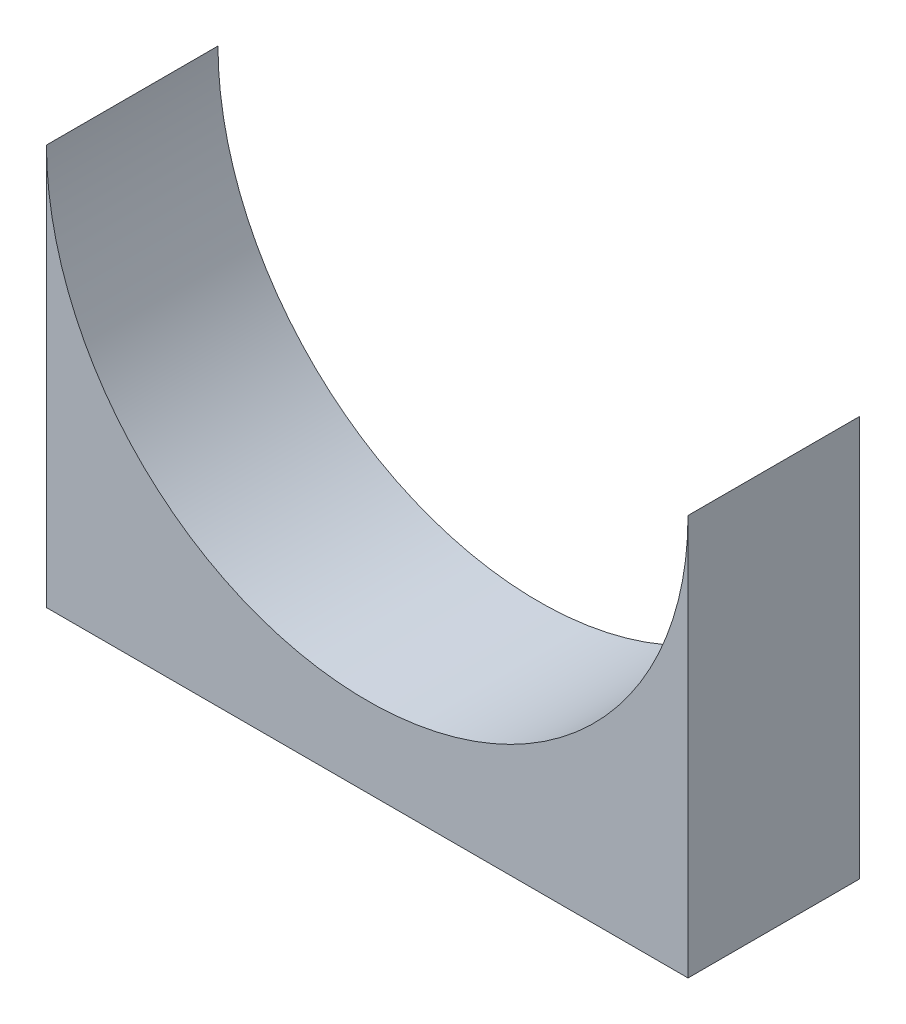
ISO-10303-21;
HEADER;
FILE_DESCRIPTION(('STEP AP214'),'2;1');
FILE_NAME('part.step','',(''),(''),'','','');
FILE_SCHEMA(('AUTOMOTIVE_DESIGN { 1 0 10303 214 1 1 1 1 }'));
ENDSEC;
DATA;
#1=APPLICATION_CONTEXT('core data for automotive mechanical design processes');
#2=APPLICATION_PROTOCOL_DEFINITION('international standard','automotive_design',2000,#1);
#3=PRODUCT_CONTEXT('',#1,'mechanical');
#4=PRODUCT('Part','Part','',(#3));
#5=PRODUCT_RELATED_PRODUCT_CATEGORY('part','',(#4));
#6=PRODUCT_DEFINITION_FORMATION('','',#4);
#7=PRODUCT_DEFINITION_CONTEXT('part definition',#1,'design');
#8=PRODUCT_DEFINITION('design','',#6,#7);
#9=PRODUCT_DEFINITION_SHAPE('','',#8);
#10=(LENGTH_UNIT() NAMED_UNIT(*) SI_UNIT(.MILLI.,.METRE.));
#11=(NAMED_UNIT(*) PLANE_ANGLE_UNIT() SI_UNIT($,.RADIAN.));
#12=(NAMED_UNIT(*) SI_UNIT($,.STERADIAN.) SOLID_ANGLE_UNIT());
#13=UNCERTAINTY_MEASURE_WITH_UNIT(LENGTH_MEASURE(1.E-05),#10,'distance_accuracy_value','');
#14=(GEOMETRIC_REPRESENTATION_CONTEXT(3) GLOBAL_UNCERTAINTY_ASSIGNED_CONTEXT((#13)) GLOBAL_UNIT_ASSIGNED_CONTEXT((#10,
#11,#12)) REPRESENTATION_CONTEXT('',''));
#15=CARTESIAN_POINT('',(0.,0.,0.));
#16=DIRECTION('',(0.,0.,1.));
#17=DIRECTION('',(1.,0.,0.));
#18=AXIS2_PLACEMENT_3D('',#15,#16,#17);
#19=CARTESIAN_POINT('',(0.,11.6748648648649,10.));
#20=DIRECTION('',(0.,0.,-1.));
#21=DIRECTION('',(-1.,0.,0.));
#22=AXIS2_PLACEMENT_3D('',#19,#20,#21);
#23=CYLINDRICAL_SURFACE('',#22,18.7);
#24=CARTESIAN_POINT('',(0.,11.6748648648649,0.));
#25=DIRECTION('',(0.,0.,-1.));
#26=DIRECTION('',(1.,0.,0.));
#27=AXIS2_PLACEMENT_3D('',#24,#25,#26);
#28=CIRCLE('',#27,18.7);
#29=CARTESIAN_POINT('',(18.7,11.6748648648649,0.));
#30=VERTEX_POINT('',#29);
#31=CARTESIAN_POINT('',(-18.7,11.6748648648649,0.));
#32=VERTEX_POINT('',#31);
#33=EDGE_CURVE('E100',#30,#32,#28,.T.);
#34=ORIENTED_EDGE('',*,*,#33,.T.);
#35=DIRECTION('',(0.,0.,-1.));
#36=VECTOR('',#35,1.);
#37=CARTESIAN_POINT('',(-18.7,11.6748648648649,10.));
#38=LINE('',#37,#36);
#39=CARTESIAN_POINT('',(-18.7,11.6748648648649,10.));
#40=VERTEX_POINT('',#39);
#41=EDGE_CURVE('E11',#40,#32,#38,.T.);
#42=ORIENTED_EDGE('',*,*,#41,.F.);
#43=CARTESIAN_POINT('',(0.,11.6748648648649,10.));
#44=DIRECTION('',(0.,0.,-1.));
#45=DIRECTION('',(1.,0.,0.));
#46=AXIS2_PLACEMENT_3D('',#43,#44,#45);
#47=CIRCLE('',#46,18.7);
#48=CARTESIAN_POINT('',(18.7,11.6748648648649,10.));
#49=VERTEX_POINT('',#48);
#50=EDGE_CURVE('E88',#49,#40,#47,.T.);
#51=ORIENTED_EDGE('',*,*,#50,.F.);
#52=DIRECTION('',(0.,0.,-1.));
#53=VECTOR('',#52,1.);
#54=CARTESIAN_POINT('',(18.7,11.6748648648649,10.));
#55=LINE('',#54,#53);
#56=EDGE_CURVE('E96',#49,#30,#55,.T.);
#57=ORIENTED_EDGE('',*,*,#56,.T.);
#58=EDGE_LOOP('',(#34,#42,#51,#57));
#59=FACE_BOUND('',#58,.T.);
#60=ADVANCED_FACE('F37',(#59),#23,.F.);
#61=CARTESIAN_POINT('',(-18.7,11.6748648648649,10.));
#62=DIRECTION('',(1.,0.,0.));
#63=DIRECTION('',(0.,0.,-1.));
#64=AXIS2_PLACEMENT_3D('',#61,#62,#63);
#65=PLANE('',#64);
#66=DIRECTION('',(0.,-1.,0.));
#67=VECTOR('',#66,1.);
#68=CARTESIAN_POINT('',(-18.7,11.6748648648649,0.));
#69=LINE('',#68,#67);
#70=CARTESIAN_POINT('',(-18.7,-11.6748648648649,0.));
#71=VERTEX_POINT('',#70);
#72=EDGE_CURVE('E92',#32,#71,#69,.T.);
#73=ORIENTED_EDGE('',*,*,#72,.T.);
#74=DIRECTION('',(0.,0.,-1.));
#75=VECTOR('',#74,1.);
#76=CARTESIAN_POINT('',(-18.7,-11.6748648648649,10.));
#77=LINE('',#76,#75);
#78=CARTESIAN_POINT('',(-18.7,-11.6748648648649,10.));
#79=VERTEX_POINT('',#78);
#80=EDGE_CURVE('E45',#79,#71,#77,.T.);
#81=ORIENTED_EDGE('',*,*,#80,.F.);
#82=DIRECTION('',(0.,-1.,0.));
#83=VECTOR('',#82,1.);
#84=CARTESIAN_POINT('',(-18.7,11.6748648648649,10.));
#85=LINE('',#84,#83);
#86=EDGE_CURVE('E83',#40,#79,#85,.T.);
#87=ORIENTED_EDGE('',*,*,#86,.F.);
#88=ORIENTED_EDGE('',*,*,#41,.T.);
#89=EDGE_LOOP('',(#73,#81,#87,#88));
#90=FACE_BOUND('',#89,.T.);
#91=ADVANCED_FACE('F91',(#90),#65,.F.);
#92=CARTESIAN_POINT('',(-18.7,-11.6748648648649,10.));
#93=DIRECTION('',(0.,1.,0.));
#94=DIRECTION('',(0.,0.,1.));
#95=AXIS2_PLACEMENT_3D('',#92,#93,#94);
#96=PLANE('',#95);
#97=DIRECTION('',(1.,0.,0.));
#98=VECTOR('',#97,1.);
#99=CARTESIAN_POINT('',(-18.7,-11.6748648648649,0.));
#100=LINE('',#99,#98);
#101=CARTESIAN_POINT('',(18.7,-11.6748648648649,0.));
#102=VERTEX_POINT('',#101);
#103=EDGE_CURVE('E70',#71,#102,#100,.T.);
#104=ORIENTED_EDGE('',*,*,#103,.T.);
#105=DIRECTION('',(0.,0.,-1.));
#106=VECTOR('',#105,1.);
#107=CARTESIAN_POINT('',(18.7,-11.6748648648649,10.));
#108=LINE('',#107,#106);
#109=CARTESIAN_POINT('',(18.7,-11.6748648648649,10.));
#110=VERTEX_POINT('',#109);
#111=EDGE_CURVE('E93',#110,#102,#108,.T.);
#112=ORIENTED_EDGE('',*,*,#111,.F.);
#113=DIRECTION('',(1.,0.,0.));
#114=VECTOR('',#113,1.);
#115=CARTESIAN_POINT('',(-18.7,-11.6748648648649,10.));
#116=LINE('',#115,#114);
#117=EDGE_CURVE('E86',#79,#110,#116,.T.);
#118=ORIENTED_EDGE('',*,*,#117,.F.);
#119=ORIENTED_EDGE('',*,*,#80,.T.);
#120=EDGE_LOOP('',(#104,#112,#118,#119));
#121=FACE_BOUND('',#120,.T.);
#122=ADVANCED_FACE('F94',(#121),#96,.F.);
#123=CARTESIAN_POINT('',(18.7,-11.6748648648649,10.));
#124=DIRECTION('',(-1.,0.,0.));
#125=DIRECTION('',(0.,0.,1.));
#126=AXIS2_PLACEMENT_3D('',#123,#124,#125);
#127=PLANE('',#126);
#128=DIRECTION('',(0.,1.,0.));
#129=VECTOR('',#128,1.);
#130=CARTESIAN_POINT('',(18.7,-11.6748648648649,0.));
#131=LINE('',#130,#129);
#132=EDGE_CURVE('E76',#102,#30,#131,.T.);
#133=ORIENTED_EDGE('',*,*,#132,.T.);
#134=ORIENTED_EDGE('',*,*,#56,.F.);
#135=DIRECTION('',(0.,1.,0.));
#136=VECTOR('',#135,1.);
#137=CARTESIAN_POINT('',(18.7,-11.6748648648649,10.));
#138=LINE('',#137,#136);
#139=EDGE_CURVE('E53',#110,#49,#138,.T.);
#140=ORIENTED_EDGE('',*,*,#139,.F.);
#141=ORIENTED_EDGE('',*,*,#111,.T.);
#142=EDGE_LOOP('',(#133,#134,#140,#141));
#143=FACE_BOUND('',#142,.T.);
#144=ADVANCED_FACE('F107',(#143),#127,.F.);
#145=CARTESIAN_POINT('',(0.,11.6748648648649,10.));
#146=DIRECTION('',(0.,0.,1.));
#147=DIRECTION('',(1.,0.,0.));
#148=AXIS2_PLACEMENT_3D('',#145,#146,#147);
#149=PLANE('',#148);
#150=ORIENTED_EDGE('',*,*,#50,.T.);
#151=ORIENTED_EDGE('',*,*,#86,.T.);
#152=ORIENTED_EDGE('',*,*,#117,.T.);
#153=ORIENTED_EDGE('',*,*,#139,.T.);
#154=EDGE_LOOP('',(#150,#151,#152,#153));
#155=FACE_BOUND('',#154,.T.);
#156=ADVANCED_FACE('F84',(#155),#149,.T.);
#157=CARTESIAN_POINT('',(0.,11.6748648648649,0.));
#158=DIRECTION('',(0.,0.,1.));
#159=DIRECTION('',(1.,0.,0.));
#160=AXIS2_PLACEMENT_3D('',#157,#158,#159);
#161=PLANE('',#160);
#162=ORIENTED_EDGE('',*,*,#33,.F.);
#163=ORIENTED_EDGE('',*,*,#132,.F.);
#164=ORIENTED_EDGE('',*,*,#103,.F.);
#165=ORIENTED_EDGE('',*,*,#72,.F.);
#166=EDGE_LOOP('',(#162,#163,#164,#165));
#167=FACE_BOUND('',#166,.T.);
#168=ADVANCED_FACE('F110',(#167),#161,.F.);
#169=CLOSED_SHELL('',(#60,#91,#122,#144,#156,#168));
#170=MANIFOLD_SOLID_BREP('B2',#169);
#171=ADVANCED_BREP_SHAPE_REPRESENTATION('',(#18,#170),#14);
#172=SHAPE_DEFINITION_REPRESENTATION(#9,#171);
ENDSEC;
END-ISO-10303-21;
